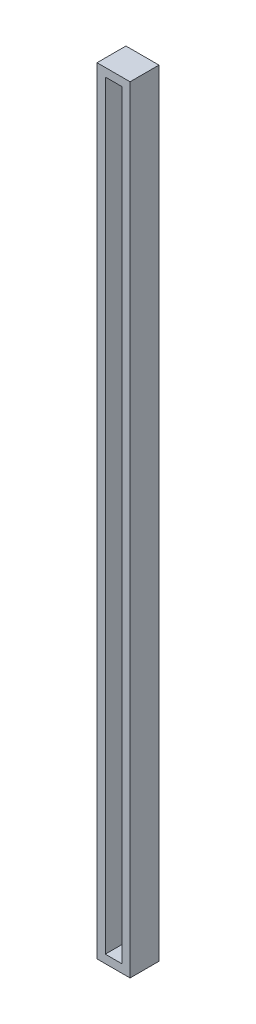
ISO-10303-21;
HEADER;
FILE_DESCRIPTION(('STEP AP214'),'2;1');
FILE_NAME('part.step','',(''),(''),'','','');
FILE_SCHEMA(('AUTOMOTIVE_DESIGN { 1 0 10303 214 1 1 1 1 }'));
ENDSEC;
DATA;
#1=APPLICATION_CONTEXT('core data for automotive mechanical design processes');
#2=APPLICATION_PROTOCOL_DEFINITION('international standard','automotive_design',2000,#1);
#3=PRODUCT_CONTEXT('',#1,'mechanical');
#4=PRODUCT('Part','Part','',(#3));
#5=PRODUCT_RELATED_PRODUCT_CATEGORY('part','',(#4));
#6=PRODUCT_DEFINITION_FORMATION('','',#4);
#7=PRODUCT_DEFINITION_CONTEXT('part definition',#1,'design');
#8=PRODUCT_DEFINITION('design','',#6,#7);
#9=PRODUCT_DEFINITION_SHAPE('','',#8);
#10=(LENGTH_UNIT() NAMED_UNIT(*) SI_UNIT(.MILLI.,.METRE.));
#11=(NAMED_UNIT(*) PLANE_ANGLE_UNIT() SI_UNIT($,.RADIAN.));
#12=(NAMED_UNIT(*) SI_UNIT($,.STERADIAN.) SOLID_ANGLE_UNIT());
#13=UNCERTAINTY_MEASURE_WITH_UNIT(LENGTH_MEASURE(1.E-05),#10,'distance_accuracy_value','');
#14=(GEOMETRIC_REPRESENTATION_CONTEXT(3) GLOBAL_UNCERTAINTY_ASSIGNED_CONTEXT((#13)) GLOBAL_UNIT_ASSIGNED_CONTEXT((#10,
#11,#12)) REPRESENTATION_CONTEXT('',''));
#15=CARTESIAN_POINT('',(0.,0.,0.));
#16=DIRECTION('',(0.,0.,1.));
#17=DIRECTION('',(1.,0.,0.));
#18=AXIS2_PLACEMENT_3D('',#15,#16,#17);
#19=CARTESIAN_POINT('',(0.,0.,7.));
#20=DIRECTION('',(0.,0.,-1.));
#21=DIRECTION('',(-1.,0.,0.));
#22=AXIS2_PLACEMENT_3D('',#19,#20,#21);
#23=PLANE('',#22);
#24=DIRECTION('',(0.,-1.,0.));
#25=VECTOR('',#24,1.);
#26=CARTESIAN_POINT('',(0.,0.,7.));
#27=LINE('',#26,#25);
#28=CARTESIAN_POINT('',(0.,188.,7.));
#29=VERTEX_POINT('',#28);
#30=CARTESIAN_POINT('',(0.,0.,7.));
#31=VERTEX_POINT('',#30);
#32=EDGE_CURVE('E143',#29,#31,#27,.T.);
#33=ORIENTED_EDGE('',*,*,#32,.T.);
#34=DIRECTION('',(1.,0.,0.));
#35=VECTOR('',#34,1.);
#36=CARTESIAN_POINT('',(0.,0.,7.));
#37=LINE('',#36,#35);
#38=CARTESIAN_POINT('',(8.,0.,7.));
#39=VERTEX_POINT('',#38);
#40=EDGE_CURVE('E150',#31,#39,#37,.T.);
#41=ORIENTED_EDGE('',*,*,#40,.T.);
#42=DIRECTION('',(0.,1.,0.));
#43=VECTOR('',#42,1.);
#44=CARTESIAN_POINT('',(8.,0.,7.));
#45=LINE('',#44,#43);
#46=CARTESIAN_POINT('',(8.,188.,7.));
#47=VERTEX_POINT('',#46);
#48=EDGE_CURVE('E148',#39,#47,#45,.T.);
#49=ORIENTED_EDGE('',*,*,#48,.T.);
#50=DIRECTION('',(-1.,0.,0.));
#51=VECTOR('',#50,1.);
#52=CARTESIAN_POINT('',(0.,188.,7.));
#53=LINE('',#52,#51);
#54=EDGE_CURVE('E155',#47,#29,#53,.T.);
#55=ORIENTED_EDGE('',*,*,#54,.T.);
#56=EDGE_LOOP('',(#33,#41,#49,#55));
#57=FACE_BOUND('',#56,.T.);
#58=DIRECTION('',(0.,-1.,0.));
#59=VECTOR('',#58,1.);
#60=CARTESIAN_POINT('',(2.,2.,7.));
#61=LINE('',#60,#59);
#62=CARTESIAN_POINT('',(2.,186.,7.));
#63=VERTEX_POINT('',#62);
#64=CARTESIAN_POINT('',(2.,2.,7.));
#65=VERTEX_POINT('',#64);
#66=EDGE_CURVE('E106',#63,#65,#61,.T.);
#67=ORIENTED_EDGE('',*,*,#66,.F.);
#68=DIRECTION('',(-1.,0.,0.));
#69=VECTOR('',#68,1.);
#70=CARTESIAN_POINT('',(2.,186.,7.));
#71=LINE('',#70,#69);
#72=CARTESIAN_POINT('',(6.,186.,7.));
#73=VERTEX_POINT('',#72);
#74=EDGE_CURVE('E127',#73,#63,#71,.T.);
#75=ORIENTED_EDGE('',*,*,#74,.F.);
#76=DIRECTION('',(0.,1.,0.));
#77=VECTOR('',#76,1.);
#78=CARTESIAN_POINT('',(6.,2.,7.));
#79=LINE('',#78,#77);
#80=CARTESIAN_POINT('',(6.,2.,7.));
#81=VERTEX_POINT('',#80);
#82=EDGE_CURVE('E126',#81,#73,#79,.T.);
#83=ORIENTED_EDGE('',*,*,#82,.F.);
#84=DIRECTION('',(1.,0.,0.));
#85=VECTOR('',#84,1.);
#86=CARTESIAN_POINT('',(2.,2.,7.));
#87=LINE('',#86,#85);
#88=EDGE_CURVE('E118',#65,#81,#87,.T.);
#89=ORIENTED_EDGE('',*,*,#88,.F.);
#90=EDGE_LOOP('',(#67,#75,#83,#89));
#91=FACE_BOUND('',#90,.T.);
#92=ADVANCED_FACE('F43',(#57,#91),#23,.F.);
#93=CARTESIAN_POINT('',(0.,0.,0.));
#94=DIRECTION('',(0.,0.,-1.));
#95=DIRECTION('',(-1.,0.,0.));
#96=AXIS2_PLACEMENT_3D('',#93,#94,#95);
#97=PLANE('',#96);
#98=DIRECTION('',(0.,-1.,0.));
#99=VECTOR('',#98,1.);
#100=CARTESIAN_POINT('',(0.,0.,0.));
#101=LINE('',#100,#99);
#102=CARTESIAN_POINT('',(0.,188.,0.));
#103=VERTEX_POINT('',#102);
#104=CARTESIAN_POINT('',(0.,0.,0.));
#105=VERTEX_POINT('',#104);
#106=EDGE_CURVE('E125',#103,#105,#101,.T.);
#107=ORIENTED_EDGE('',*,*,#106,.F.);
#108=DIRECTION('',(-1.,0.,0.));
#109=VECTOR('',#108,1.);
#110=CARTESIAN_POINT('',(0.,188.,0.));
#111=LINE('',#110,#109);
#112=CARTESIAN_POINT('',(8.,188.,0.));
#113=VERTEX_POINT('',#112);
#114=EDGE_CURVE('E149',#113,#103,#111,.T.);
#115=ORIENTED_EDGE('',*,*,#114,.F.);
#116=DIRECTION('',(0.,1.,0.));
#117=VECTOR('',#116,1.);
#118=CARTESIAN_POINT('',(8.,0.,0.));
#119=LINE('',#118,#117);
#120=CARTESIAN_POINT('',(8.,0.,0.));
#121=VERTEX_POINT('',#120);
#122=EDGE_CURVE('E159',#121,#113,#119,.T.);
#123=ORIENTED_EDGE('',*,*,#122,.F.);
#124=DIRECTION('',(1.,0.,0.));
#125=VECTOR('',#124,1.);
#126=CARTESIAN_POINT('',(0.,0.,0.));
#127=LINE('',#126,#125);
#128=EDGE_CURVE('E160',#105,#121,#127,.T.);
#129=ORIENTED_EDGE('',*,*,#128,.F.);
#130=EDGE_LOOP('',(#107,#115,#123,#129));
#131=FACE_BOUND('',#130,.T.);
#132=DIRECTION('',(-1.,0.,0.));
#133=VECTOR('',#132,1.);
#134=CARTESIAN_POINT('',(2.,186.,0.));
#135=LINE('',#134,#133);
#136=CARTESIAN_POINT('',(6.,186.,0.));
#137=VERTEX_POINT('',#136);
#138=CARTESIAN_POINT('',(2.,186.,0.));
#139=VERTEX_POINT('',#138);
#140=EDGE_CURVE('E120',#137,#139,#135,.T.);
#141=ORIENTED_EDGE('',*,*,#140,.T.);
#142=DIRECTION('',(0.,-1.,0.));
#143=VECTOR('',#142,1.);
#144=CARTESIAN_POINT('',(2.,2.,0.));
#145=LINE('',#144,#143);
#146=CARTESIAN_POINT('',(2.,2.,0.));
#147=VERTEX_POINT('',#146);
#148=EDGE_CURVE('E67',#139,#147,#145,.T.);
#149=ORIENTED_EDGE('',*,*,#148,.T.);
#150=DIRECTION('',(1.,0.,0.));
#151=VECTOR('',#150,1.);
#152=CARTESIAN_POINT('',(2.,2.,0.));
#153=LINE('',#152,#151);
#154=CARTESIAN_POINT('',(6.,2.,0.));
#155=VERTEX_POINT('',#154);
#156=EDGE_CURVE('E121',#147,#155,#153,.T.);
#157=ORIENTED_EDGE('',*,*,#156,.T.);
#158=DIRECTION('',(0.,1.,0.));
#159=VECTOR('',#158,1.);
#160=CARTESIAN_POINT('',(6.,2.,0.));
#161=LINE('',#160,#159);
#162=EDGE_CURVE('E136',#155,#137,#161,.T.);
#163=ORIENTED_EDGE('',*,*,#162,.T.);
#164=EDGE_LOOP('',(#141,#149,#157,#163));
#165=FACE_BOUND('',#164,.T.);
#166=ADVANCED_FACE('F180',(#131,#165),#97,.T.);
#167=CARTESIAN_POINT('',(0.,0.,7.));
#168=DIRECTION('',(1.,0.,0.));
#169=DIRECTION('',(0.,0.,-1.));
#170=AXIS2_PLACEMENT_3D('',#167,#168,#169);
#171=PLANE('',#170);
#172=ORIENTED_EDGE('',*,*,#106,.T.);
#173=DIRECTION('',(0.,0.,-1.));
#174=VECTOR('',#173,1.);
#175=CARTESIAN_POINT('',(0.,0.,7.));
#176=LINE('',#175,#174);
#177=EDGE_CURVE('E11',#31,#105,#176,.T.);
#178=ORIENTED_EDGE('',*,*,#177,.F.);
#179=ORIENTED_EDGE('',*,*,#32,.F.);
#180=DIRECTION('',(0.,0.,-1.));
#181=VECTOR('',#180,1.);
#182=CARTESIAN_POINT('',(0.,188.,7.));
#183=LINE('',#182,#181);
#184=EDGE_CURVE('E152',#29,#103,#183,.T.);
#185=ORIENTED_EDGE('',*,*,#184,.T.);
#186=EDGE_LOOP('',(#172,#178,#179,#185));
#187=FACE_BOUND('',#186,.T.);
#188=ADVANCED_FACE('F44',(#187),#171,.F.);
#189=CARTESIAN_POINT('',(0.,0.,7.));
#190=DIRECTION('',(0.,1.,0.));
#191=DIRECTION('',(0.,0.,1.));
#192=AXIS2_PLACEMENT_3D('',#189,#190,#191);
#193=PLANE('',#192);
#194=ORIENTED_EDGE('',*,*,#128,.T.);
#195=DIRECTION('',(0.,0.,-1.));
#196=VECTOR('',#195,1.);
#197=CARTESIAN_POINT('',(8.,0.,7.));
#198=LINE('',#197,#196);
#199=EDGE_CURVE('E51',#39,#121,#198,.T.);
#200=ORIENTED_EDGE('',*,*,#199,.F.);
#201=ORIENTED_EDGE('',*,*,#40,.F.);
#202=ORIENTED_EDGE('',*,*,#177,.T.);
#203=EDGE_LOOP('',(#194,#200,#201,#202));
#204=FACE_BOUND('',#203,.T.);
#205=ADVANCED_FACE('F190',(#204),#193,.F.);
#206=CARTESIAN_POINT('',(8.,0.,7.));
#207=DIRECTION('',(-1.,0.,0.));
#208=DIRECTION('',(0.,0.,1.));
#209=AXIS2_PLACEMENT_3D('',#206,#207,#208);
#210=PLANE('',#209);
#211=ORIENTED_EDGE('',*,*,#122,.T.);
#212=DIRECTION('',(0.,0.,-1.));
#213=VECTOR('',#212,1.);
#214=CARTESIAN_POINT('',(8.,188.,7.));
#215=LINE('',#214,#213);
#216=EDGE_CURVE('E162',#47,#113,#215,.T.);
#217=ORIENTED_EDGE('',*,*,#216,.F.);
#218=ORIENTED_EDGE('',*,*,#48,.F.);
#219=ORIENTED_EDGE('',*,*,#199,.T.);
#220=EDGE_LOOP('',(#211,#217,#218,#219));
#221=FACE_BOUND('',#220,.T.);
#222=ADVANCED_FACE('F173',(#221),#210,.F.);
#223=CARTESIAN_POINT('',(0.,188.,7.));
#224=DIRECTION('',(0.,-1.,0.));
#225=DIRECTION('',(0.,0.,-1.));
#226=AXIS2_PLACEMENT_3D('',#223,#224,#225);
#227=PLANE('',#226);
#228=ORIENTED_EDGE('',*,*,#114,.T.);
#229=ORIENTED_EDGE('',*,*,#184,.F.);
#230=ORIENTED_EDGE('',*,*,#54,.F.);
#231=ORIENTED_EDGE('',*,*,#216,.T.);
#232=EDGE_LOOP('',(#228,#229,#230,#231));
#233=FACE_BOUND('',#232,.T.);
#234=ADVANCED_FACE('F181',(#233),#227,.F.);
#235=CARTESIAN_POINT('',(2.,2.,7.));
#236=DIRECTION('',(1.,0.,0.));
#237=DIRECTION('',(0.,0.,-1.));
#238=AXIS2_PLACEMENT_3D('',#235,#236,#237);
#239=PLANE('',#238);
#240=ORIENTED_EDGE('',*,*,#148,.F.);
#241=DIRECTION('',(0.,0.,-1.));
#242=VECTOR('',#241,1.);
#243=CARTESIAN_POINT('',(2.,186.,7.));
#244=LINE('',#243,#242);
#245=EDGE_CURVE('E115',#63,#139,#244,.T.);
#246=ORIENTED_EDGE('',*,*,#245,.F.);
#247=ORIENTED_EDGE('',*,*,#66,.T.);
#248=DIRECTION('',(0.,0.,-1.));
#249=VECTOR('',#248,1.);
#250=CARTESIAN_POINT('',(2.,2.,7.));
#251=LINE('',#250,#249);
#252=EDGE_CURVE('E112',#65,#147,#251,.T.);
#253=ORIENTED_EDGE('',*,*,#252,.T.);
#254=EDGE_LOOP('',(#240,#246,#247,#253));
#255=FACE_BOUND('',#254,.T.);
#256=ADVANCED_FACE('F109',(#255),#239,.T.);
#257=CARTESIAN_POINT('',(2.,2.,7.));
#258=DIRECTION('',(0.,1.,0.));
#259=DIRECTION('',(0.,0.,1.));
#260=AXIS2_PLACEMENT_3D('',#257,#258,#259);
#261=PLANE('',#260);
#262=ORIENTED_EDGE('',*,*,#156,.F.);
#263=ORIENTED_EDGE('',*,*,#252,.F.);
#264=ORIENTED_EDGE('',*,*,#88,.T.);
#265=DIRECTION('',(0.,0.,-1.));
#266=VECTOR('',#265,1.);
#267=CARTESIAN_POINT('',(6.,2.,7.));
#268=LINE('',#267,#266);
#269=EDGE_CURVE('E124',#81,#155,#268,.T.);
#270=ORIENTED_EDGE('',*,*,#269,.T.);
#271=EDGE_LOOP('',(#262,#263,#264,#270));
#272=FACE_BOUND('',#271,.T.);
#273=ADVANCED_FACE('F119',(#272),#261,.T.);
#274=CARTESIAN_POINT('',(6.,2.,7.));
#275=DIRECTION('',(-1.,0.,0.));
#276=DIRECTION('',(0.,0.,1.));
#277=AXIS2_PLACEMENT_3D('',#274,#275,#276);
#278=PLANE('',#277);
#279=ORIENTED_EDGE('',*,*,#162,.F.);
#280=ORIENTED_EDGE('',*,*,#269,.F.);
#281=ORIENTED_EDGE('',*,*,#82,.T.);
#282=DIRECTION('',(0.,0.,-1.));
#283=VECTOR('',#282,1.);
#284=CARTESIAN_POINT('',(6.,186.,7.));
#285=LINE('',#284,#283);
#286=EDGE_CURVE('E59',#73,#137,#285,.T.);
#287=ORIENTED_EDGE('',*,*,#286,.T.);
#288=EDGE_LOOP('',(#279,#280,#281,#287));
#289=FACE_BOUND('',#288,.T.);
#290=ADVANCED_FACE('F209',(#289),#278,.T.);
#291=CARTESIAN_POINT('',(2.,186.,7.));
#292=DIRECTION('',(0.,-1.,0.));
#293=DIRECTION('',(0.,0.,-1.));
#294=AXIS2_PLACEMENT_3D('',#291,#292,#293);
#295=PLANE('',#294);
#296=ORIENTED_EDGE('',*,*,#140,.F.);
#297=ORIENTED_EDGE('',*,*,#286,.F.);
#298=ORIENTED_EDGE('',*,*,#74,.T.);
#299=ORIENTED_EDGE('',*,*,#245,.T.);
#300=EDGE_LOOP('',(#296,#297,#298,#299));
#301=FACE_BOUND('',#300,.T.);
#302=ADVANCED_FACE('F215',(#301),#295,.T.);
#303=CLOSED_SHELL('',(#92,#166,#188,#205,#222,#234,#256,#273,#290,#302));
#304=MANIFOLD_SOLID_BREP('B2',#303);
#305=ADVANCED_BREP_SHAPE_REPRESENTATION('',(#18,#304),#14);
#306=SHAPE_DEFINITION_REPRESENTATION(#9,#305);
ENDSEC;
END-ISO-10303-21;
